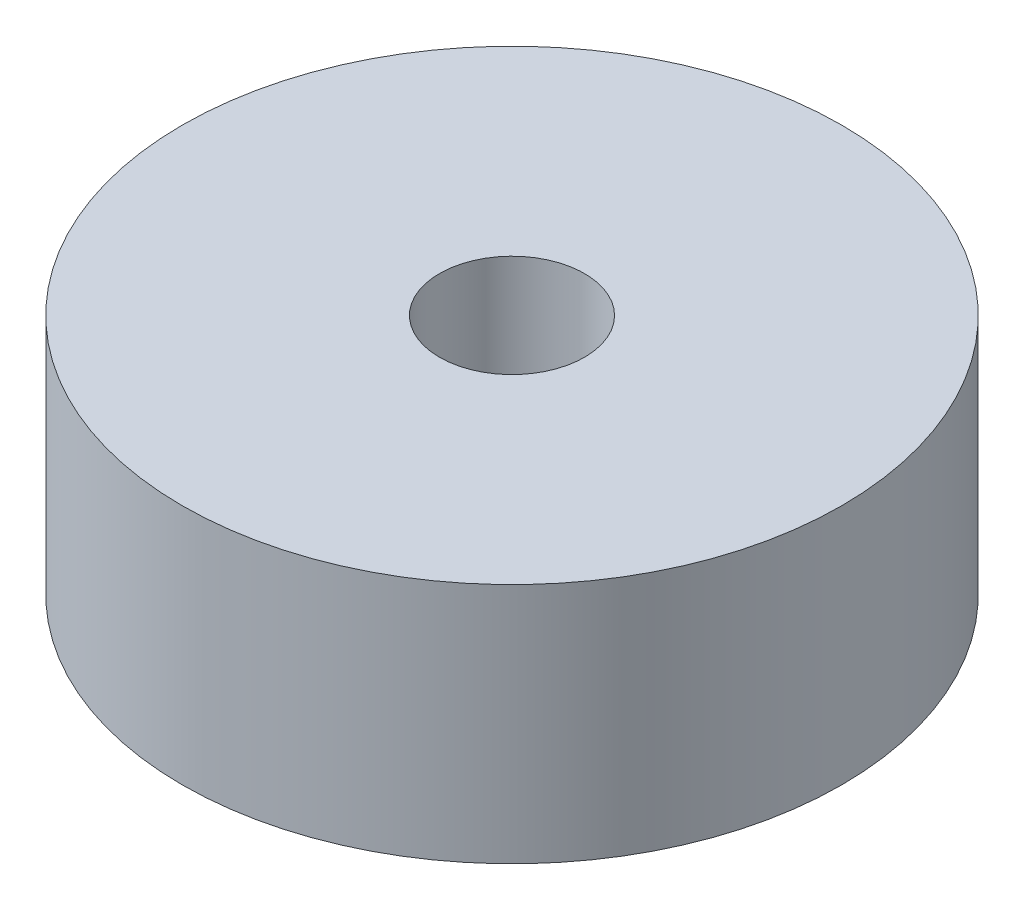
ISO-10303-21;
HEADER;
FILE_DESCRIPTION(('STEP AP214'),'2;1');
FILE_NAME('part.step','',(''),(''),'','','');
FILE_SCHEMA(('AUTOMOTIVE_DESIGN { 1 0 10303 214 1 1 1 1 }'));
ENDSEC;
DATA;
#1=APPLICATION_CONTEXT('core data for automotive mechanical design processes');
#2=APPLICATION_PROTOCOL_DEFINITION('international standard','automotive_design',2000,#1);
#3=PRODUCT_CONTEXT('',#1,'mechanical');
#4=PRODUCT('Part','Part','',(#3));
#5=PRODUCT_RELATED_PRODUCT_CATEGORY('part','',(#4));
#6=PRODUCT_DEFINITION_FORMATION('','',#4);
#7=PRODUCT_DEFINITION_CONTEXT('part definition',#1,'design');
#8=PRODUCT_DEFINITION('design','',#6,#7);
#9=PRODUCT_DEFINITION_SHAPE('','',#8);
#10=(LENGTH_UNIT() NAMED_UNIT(*) SI_UNIT(.MILLI.,.METRE.));
#11=(NAMED_UNIT(*) PLANE_ANGLE_UNIT() SI_UNIT($,.RADIAN.));
#12=(NAMED_UNIT(*) SI_UNIT($,.STERADIAN.) SOLID_ANGLE_UNIT());
#13=UNCERTAINTY_MEASURE_WITH_UNIT(LENGTH_MEASURE(1.E-05),#10,'distance_accuracy_value','');
#14=(GEOMETRIC_REPRESENTATION_CONTEXT(3) GLOBAL_UNCERTAINTY_ASSIGNED_CONTEXT((#13)) GLOBAL_UNIT_ASSIGNED_CONTEXT((#10,
#11,#12)) REPRESENTATION_CONTEXT('',''));
#15=CARTESIAN_POINT('',(0.,0.,0.));
#16=DIRECTION('',(0.,0.,1.));
#17=DIRECTION('',(1.,0.,0.));
#18=AXIS2_PLACEMENT_3D('',#15,#16,#17);
#19=CARTESIAN_POINT('',(0.,11.,0.));
#20=DIRECTION('',(0.,1.,0.));
#21=DIRECTION('',(0.,0.,1.));
#22=AXIS2_PLACEMENT_3D('',#19,#20,#21);
#23=PLANE('',#22);
#24=CARTESIAN_POINT('',(0.,11.,0.));
#25=DIRECTION('',(0.,1.,0.));
#26=DIRECTION('',(0.,0.,1.));
#27=AXIS2_PLACEMENT_3D('',#24,#25,#26);
#28=CIRCLE('',#27,15.);
#29=CARTESIAN_POINT('',(0.,11.,15.));
#30=VERTEX_POINT('',#29);
#31=EDGE_CURVE('E10',#30,#30,#28,.T.);
#32=ORIENTED_EDGE('',*,*,#31,.T.);
#33=EDGE_LOOP('',(#32));
#34=FACE_BOUND('',#33,.T.);
#35=CARTESIAN_POINT('',(0.,11.,0.));
#36=DIRECTION('',(0.,1.,0.));
#37=DIRECTION('',(0.,0.,1.));
#38=AXIS2_PLACEMENT_3D('',#35,#36,#37);
#39=CIRCLE('',#38,3.3);
#40=CARTESIAN_POINT('',(0.,11.,3.3));
#41=VERTEX_POINT('',#40);
#42=EDGE_CURVE('E48',#41,#41,#39,.T.);
#43=ORIENTED_EDGE('',*,*,#42,.F.);
#44=EDGE_LOOP('',(#43));
#45=FACE_BOUND('',#44,.T.);
#46=ADVANCED_FACE('F37',(#34,#45),#23,.T.);
#47=CARTESIAN_POINT('',(0.,0.,0.));
#48=DIRECTION('',(0.,1.,0.));
#49=DIRECTION('',(0.,0.,1.));
#50=AXIS2_PLACEMENT_3D('',#47,#48,#49);
#51=PLANE('',#50);
#52=CARTESIAN_POINT('',(0.,0.,0.));
#53=DIRECTION('',(0.,1.,0.));
#54=DIRECTION('',(0.,0.,1.));
#55=AXIS2_PLACEMENT_3D('',#52,#53,#54);
#56=CIRCLE('',#55,15.);
#57=CARTESIAN_POINT('',(0.,0.,15.));
#58=VERTEX_POINT('',#57);
#59=EDGE_CURVE('E41',#58,#58,#56,.T.);
#60=ORIENTED_EDGE('',*,*,#59,.F.);
#61=EDGE_LOOP('',(#60));
#62=FACE_BOUND('',#61,.T.);
#63=CARTESIAN_POINT('',(0.,0.,0.));
#64=DIRECTION('',(0.,1.,0.));
#65=DIRECTION('',(0.,0.,1.));
#66=AXIS2_PLACEMENT_3D('',#63,#64,#65);
#67=CIRCLE('',#66,3.3);
#68=CARTESIAN_POINT('',(0.,0.,3.3));
#69=VERTEX_POINT('',#68);
#70=EDGE_CURVE('E50',#69,#69,#67,.T.);
#71=ORIENTED_EDGE('',*,*,#70,.T.);
#72=EDGE_LOOP('',(#71));
#73=FACE_BOUND('',#72,.T.);
#74=ADVANCED_FACE('F60',(#62,#73),#51,.F.);
#75=CARTESIAN_POINT('',(0.,11.,0.));
#76=DIRECTION('',(0.,-1.,0.));
#77=DIRECTION('',(0.,0.,-1.));
#78=AXIS2_PLACEMENT_3D('',#75,#76,#77);
#79=CYLINDRICAL_SURFACE('',#78,15.);
#80=ORIENTED_EDGE('',*,*,#31,.F.);
#81=EDGE_LOOP('',(#80));
#82=FACE_BOUND('',#81,.T.);
#83=ORIENTED_EDGE('',*,*,#59,.T.);
#84=EDGE_LOOP('',(#83));
#85=FACE_BOUND('',#84,.T.);
#86=ADVANCED_FACE('F39',(#82,#85),#79,.T.);
#87=CARTESIAN_POINT('',(0.,11.,0.));
#88=DIRECTION('',(0.,-1.,0.));
#89=DIRECTION('',(0.,0.,-1.));
#90=AXIS2_PLACEMENT_3D('',#87,#88,#89);
#91=CYLINDRICAL_SURFACE('',#90,3.3);
#92=ORIENTED_EDGE('',*,*,#42,.T.);
#93=EDGE_LOOP('',(#92));
#94=FACE_BOUND('',#93,.T.);
#95=ORIENTED_EDGE('',*,*,#70,.F.);
#96=EDGE_LOOP('',(#95));
#97=FACE_BOUND('',#96,.T.);
#98=ADVANCED_FACE('F56',(#94,#97),#91,.F.);
#99=CLOSED_SHELL('',(#46,#74,#86,#98));
#100=MANIFOLD_SOLID_BREP('B2',#99);
#101=ADVANCED_BREP_SHAPE_REPRESENTATION('',(#18,#100),#14);
#102=SHAPE_DEFINITION_REPRESENTATION(#9,#101);
ENDSEC;
END-ISO-10303-21;
